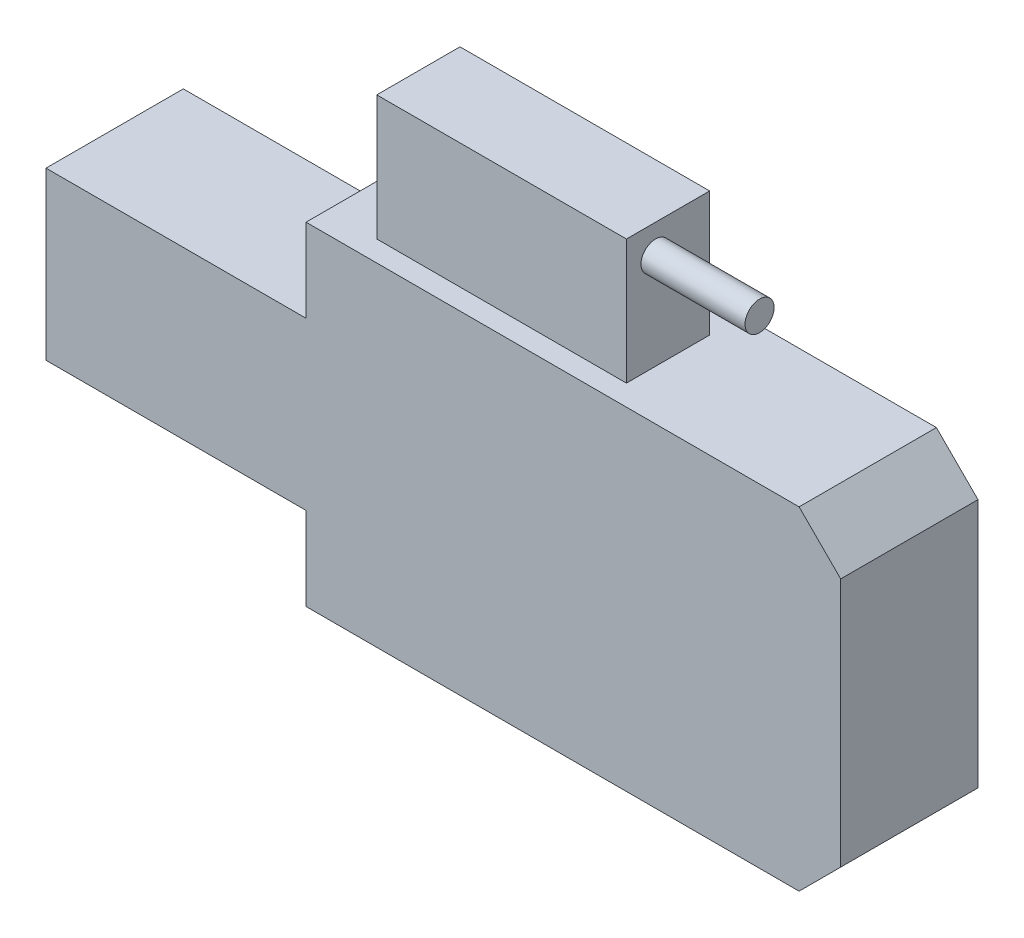
ISO-10303-21;
HEADER;
FILE_DESCRIPTION(('STEP AP214'),'2;1');
FILE_NAME('part.step','',(''),(''),'','','');
FILE_SCHEMA(('AUTOMOTIVE_DESIGN { 1 0 10303 214 1 1 1 1 }'));
ENDSEC;
DATA;
#1=APPLICATION_CONTEXT('core data for automotive mechanical design processes');
#2=APPLICATION_PROTOCOL_DEFINITION('international standard','automotive_design',2000,#1);
#3=PRODUCT_CONTEXT('',#1,'mechanical');
#4=PRODUCT('Part','Part','',(#3));
#5=PRODUCT_RELATED_PRODUCT_CATEGORY('part','',(#4));
#6=PRODUCT_DEFINITION_FORMATION('','',#4);
#7=PRODUCT_DEFINITION_CONTEXT('part definition',#1,'design');
#8=PRODUCT_DEFINITION('design','',#6,#7);
#9=PRODUCT_DEFINITION_SHAPE('','',#8);
#10=(LENGTH_UNIT() NAMED_UNIT(*) SI_UNIT(.MILLI.,.METRE.));
#11=(NAMED_UNIT(*) PLANE_ANGLE_UNIT() SI_UNIT($,.RADIAN.));
#12=(NAMED_UNIT(*) SI_UNIT($,.STERADIAN.) SOLID_ANGLE_UNIT());
#13=UNCERTAINTY_MEASURE_WITH_UNIT(LENGTH_MEASURE(1.E-05),#10,'distance_accuracy_value','');
#14=(GEOMETRIC_REPRESENTATION_CONTEXT(3) GLOBAL_UNCERTAINTY_ASSIGNED_CONTEXT((#13)) GLOBAL_UNIT_ASSIGNED_CONTEXT((#10,
#11,#12)) REPRESENTATION_CONTEXT('',''));
#15=CARTESIAN_POINT('',(0.,0.,0.));
#16=DIRECTION('',(0.,0.,1.));
#17=DIRECTION('',(1.,0.,0.));
#18=AXIS2_PLACEMENT_3D('',#15,#16,#17);
#19=CARTESIAN_POINT('',(159.5,103.,21.));
#20=DIRECTION('',(1.,0.,0.));
#21=DIRECTION('',(0.,0.,-1.));
#22=AXIS2_PLACEMENT_3D('',#19,#20,#21);
#23=PLANE('',#22);
#24=CARTESIAN_POINT('',(159.5,103.,21.));
#25=DIRECTION('',(-1.,0.,0.));
#26=DIRECTION('',(0.,0.,1.));
#27=AXIS2_PLACEMENT_3D('',#24,#25,#26);
#28=CIRCLE('',#27,3.5);
#29=CARTESIAN_POINT('',(159.5,103.,24.5));
#30=VERTEX_POINT('',#29);
#31=EDGE_CURVE('E19',#30,#30,#28,.T.);
#32=ORIENTED_EDGE('',*,*,#31,.F.);
#33=EDGE_LOOP('',(#32));
#34=FACE_BOUND('',#33,.T.);
#35=ADVANCED_FACE('F16',(#34),#23,.T.);
#36=CARTESIAN_POINT('',(134.5,110.,28.));
#37=DIRECTION('',(0.,-1.,0.));
#38=DIRECTION('',(0.,0.,-1.));
#39=AXIS2_PLACEMENT_3D('',#36,#37,#38);
#40=PLANE('',#39);
#41=DIRECTION('',(1.,0.,0.));
#42=VECTOR('',#41,1.);
#43=CARTESIAN_POINT('',(74.5,110.,8.));
#44=LINE('',#43,#42);
#45=CARTESIAN_POINT('',(134.5,110.,8.));
#46=VERTEX_POINT('',#45);
#47=CARTESIAN_POINT('',(74.5,110.,8.));
#48=VERTEX_POINT('',#47);
#49=EDGE_CURVE('E117',#46,#48,#44,.F.);
#50=ORIENTED_EDGE('',*,*,#49,.T.);
#51=DIRECTION('',(0.,0.,1.));
#52=VECTOR('',#51,1.);
#53=CARTESIAN_POINT('',(74.5,110.,28.));
#54=LINE('',#53,#52);
#55=CARTESIAN_POINT('',(74.5,110.,28.));
#56=VERTEX_POINT('',#55);
#57=EDGE_CURVE('E114',#48,#56,#54,.T.);
#58=ORIENTED_EDGE('',*,*,#57,.T.);
#59=DIRECTION('',(-1.,0.,0.));
#60=VECTOR('',#59,1.);
#61=CARTESIAN_POINT('',(134.5,110.,28.));
#62=LINE('',#61,#60);
#63=CARTESIAN_POINT('',(134.5,110.,28.));
#64=VERTEX_POINT('',#63);
#65=EDGE_CURVE('E155',#56,#64,#62,.F.);
#66=ORIENTED_EDGE('',*,*,#65,.T.);
#67=DIRECTION('',(0.,0.,1.));
#68=VECTOR('',#67,1.);
#69=CARTESIAN_POINT('',(134.5,110.,8.));
#70=LINE('',#69,#68);
#71=EDGE_CURVE('E120',#64,#46,#70,.F.);
#72=ORIENTED_EDGE('',*,*,#71,.T.);
#73=EDGE_LOOP('',(#50,#58,#66,#72));
#74=FACE_BOUND('',#73,.T.);
#75=ADVANCED_FACE('F118',(#74),#40,.F.);
#76=CARTESIAN_POINT('',(159.5,103.,21.));
#77=DIRECTION('',(-1.,0.,0.));
#78=DIRECTION('',(0.,0.,1.));
#79=AXIS2_PLACEMENT_3D('',#76,#77,#78);
#80=CYLINDRICAL_SURFACE('',#79,3.5);
#81=ORIENTED_EDGE('',*,*,#31,.T.);
#82=EDGE_LOOP('',(#81));
#83=FACE_BOUND('',#82,.T.);
#84=CARTESIAN_POINT('',(134.5,103.,21.));
#85=DIRECTION('',(-1.,0.,0.));
#86=DIRECTION('',(0.,0.,1.));
#87=AXIS2_PLACEMENT_3D('',#84,#85,#86);
#88=CIRCLE('',#87,3.5);
#89=CARTESIAN_POINT('',(134.5,103.,24.5));
#90=VERTEX_POINT('',#89);
#91=EDGE_CURVE('E139',#90,#90,#88,.F.);
#92=ORIENTED_EDGE('',*,*,#91,.T.);
#93=EDGE_LOOP('',(#92));
#94=FACE_BOUND('',#93,.T.);
#95=ADVANCED_FACE('F412',(#83,#94),#80,.T.);
#96=CARTESIAN_POINT('',(74.5,110.,8.));
#97=DIRECTION('',(0.,0.,1.));
#98=DIRECTION('',(1.,0.,0.));
#99=AXIS2_PLACEMENT_3D('',#96,#97,#98);
#100=PLANE('',#99);
#101=DIRECTION('',(0.,1.,0.));
#102=VECTOR('',#101,1.);
#103=CARTESIAN_POINT('',(74.5,110.,8.));
#104=LINE('',#103,#102);
#105=CARTESIAN_POINT('',(74.5,80.,8.));
#106=VERTEX_POINT('',#105);
#107=EDGE_CURVE('E125',#106,#48,#104,.T.);
#108=ORIENTED_EDGE('',*,*,#107,.T.);
#109=ORIENTED_EDGE('',*,*,#49,.F.);
#110=DIRECTION('',(0.,1.,0.));
#111=VECTOR('',#110,1.);
#112=CARTESIAN_POINT('',(134.5,110.,8.));
#113=LINE('',#112,#111);
#114=CARTESIAN_POINT('',(134.5,80.,8.));
#115=VERTEX_POINT('',#114);
#116=EDGE_CURVE('E142',#46,#115,#113,.F.);
#117=ORIENTED_EDGE('',*,*,#116,.T.);
#118=DIRECTION('',(1.,0.,0.));
#119=VECTOR('',#118,1.);
#120=CARTESIAN_POINT('',(191.,80.,8.));
#121=LINE('',#120,#119);
#122=EDGE_CURVE('E136',#115,#106,#121,.F.);
#123=ORIENTED_EDGE('',*,*,#122,.T.);
#124=EDGE_LOOP('',(#108,#109,#117,#123));
#125=FACE_BOUND('',#124,.T.);
#126=ADVANCED_FACE('F135',(#125),#100,.F.);
#127=CARTESIAN_POINT('',(74.5,110.,28.));
#128=DIRECTION('',(1.,0.,0.));
#129=DIRECTION('',(0.,1.,0.));
#130=AXIS2_PLACEMENT_3D('',#127,#128,#129);
#131=PLANE('',#130);
#132=DIRECTION('',(0.,1.,0.));
#133=VECTOR('',#132,1.);
#134=CARTESIAN_POINT('',(74.5,110.,28.));
#135=LINE('',#134,#133);
#136=CARTESIAN_POINT('',(74.5,80.,28.));
#137=VERTEX_POINT('',#136);
#138=EDGE_CURVE('E132',#137,#56,#135,.T.);
#139=ORIENTED_EDGE('',*,*,#138,.T.);
#140=ORIENTED_EDGE('',*,*,#57,.F.);
#141=ORIENTED_EDGE('',*,*,#107,.F.);
#142=DIRECTION('',(0.,0.,1.));
#143=VECTOR('',#142,1.);
#144=CARTESIAN_POINT('',(74.5,80.,33.));
#145=LINE('',#144,#143);
#146=EDGE_CURVE('E166',#106,#137,#145,.T.);
#147=ORIENTED_EDGE('',*,*,#146,.T.);
#148=EDGE_LOOP('',(#139,#140,#141,#147));
#149=FACE_BOUND('',#148,.T.);
#150=ADVANCED_FACE('F129',(#149),#131,.F.);
#151=CARTESIAN_POINT('',(134.5,110.,28.));
#152=DIRECTION('',(0.,0.,-1.));
#153=DIRECTION('',(-1.,0.,0.));
#154=AXIS2_PLACEMENT_3D('',#151,#152,#153);
#155=PLANE('',#154);
#156=DIRECTION('',(0.,1.,0.));
#157=VECTOR('',#156,1.);
#158=CARTESIAN_POINT('',(134.5,110.,28.));
#159=LINE('',#158,#157);
#160=CARTESIAN_POINT('',(134.5,80.,28.));
#161=VERTEX_POINT('',#160);
#162=EDGE_CURVE('E149',#161,#64,#159,.T.);
#163=ORIENTED_EDGE('',*,*,#162,.T.);
#164=ORIENTED_EDGE('',*,*,#65,.F.);
#165=ORIENTED_EDGE('',*,*,#138,.F.);
#166=DIRECTION('',(1.,0.,0.));
#167=VECTOR('',#166,1.);
#168=CARTESIAN_POINT('',(191.,80.,28.));
#169=LINE('',#168,#167);
#170=EDGE_CURVE('E163',#137,#161,#169,.T.);
#171=ORIENTED_EDGE('',*,*,#170,.T.);
#172=EDGE_LOOP('',(#163,#164,#165,#171));
#173=FACE_BOUND('',#172,.T.);
#174=ADVANCED_FACE('F161',(#173),#155,.F.);
#175=CARTESIAN_POINT('',(134.5,110.,8.));
#176=DIRECTION('',(-1.,0.,0.));
#177=DIRECTION('',(0.,0.,1.));
#178=AXIS2_PLACEMENT_3D('',#175,#176,#177);
#179=PLANE('',#178);
#180=ORIENTED_EDGE('',*,*,#91,.F.);
#181=EDGE_LOOP('',(#180));
#182=FACE_BOUND('',#181,.T.);
#183=ORIENTED_EDGE('',*,*,#116,.F.);
#184=ORIENTED_EDGE('',*,*,#71,.F.);
#185=ORIENTED_EDGE('',*,*,#162,.F.);
#186=DIRECTION('',(0.,0.,1.));
#187=VECTOR('',#186,1.);
#188=CARTESIAN_POINT('',(134.5,80.,33.));
#189=LINE('',#188,#187);
#190=EDGE_CURVE('E165',#161,#115,#189,.F.);
#191=ORIENTED_EDGE('',*,*,#190,.T.);
#192=EDGE_LOOP('',(#183,#184,#185,#191));
#193=FACE_BOUND('',#192,.T.);
#194=ADVANCED_FACE('F158',(#182,#193),#179,.F.);
#195=CARTESIAN_POINT('',(0.,0.,33.));
#196=DIRECTION('',(0.,0.,1.));
#197=DIRECTION('',(1.,0.,0.));
#198=AXIS2_PLACEMENT_3D('',#195,#196,#197);
#199=PLANE('',#198);
#200=DIRECTION('',(1.,0.,0.));
#201=VECTOR('',#200,1.);
#202=CARTESIAN_POINT('',(191.,80.,33.));
#203=LINE('',#202,#201);
#204=CARTESIAN_POINT('',(181.,80.,33.));
#205=VERTEX_POINT('',#204);
#206=CARTESIAN_POINT('',(62.5,80.,33.));
#207=VERTEX_POINT('',#206);
#208=EDGE_CURVE('E174',#205,#207,#203,.F.);
#209=ORIENTED_EDGE('',*,*,#208,.T.);
#210=DIRECTION('',(0.,1.,0.));
#211=VECTOR('',#210,1.);
#212=CARTESIAN_POINT('',(62.5,80.,33.));
#213=LINE('',#212,#211);
#214=CARTESIAN_POINT('',(62.5,60.,33.));
#215=VERTEX_POINT('',#214);
#216=EDGE_CURVE('E237',#207,#215,#213,.F.);
#217=ORIENTED_EDGE('',*,*,#216,.T.);
#218=DIRECTION('',(1.,0.,0.));
#219=VECTOR('',#218,1.);
#220=CARTESIAN_POINT('',(62.5,60.,33.));
#221=LINE('',#220,#219);
#222=CARTESIAN_POINT('',(0.,60.,33.));
#223=VERTEX_POINT('',#222);
#224=EDGE_CURVE('E232',#215,#223,#221,.F.);
#225=ORIENTED_EDGE('',*,*,#224,.T.);
#226=DIRECTION('',(0.,1.,0.));
#227=VECTOR('',#226,1.);
#228=CARTESIAN_POINT('',(0.,80.,33.));
#229=LINE('',#228,#227);
#230=CARTESIAN_POINT('',(0.,20.,33.));
#231=VERTEX_POINT('',#230);
#232=EDGE_CURVE('E223',#223,#231,#229,.F.);
#233=ORIENTED_EDGE('',*,*,#232,.T.);
#234=DIRECTION('',(1.,0.,0.));
#235=VECTOR('',#234,1.);
#236=CARTESIAN_POINT('',(62.5,20.,33.));
#237=LINE('',#236,#235);
#238=CARTESIAN_POINT('',(62.5,20.,33.));
#239=VERTEX_POINT('',#238);
#240=EDGE_CURVE('E141',#231,#239,#237,.T.);
#241=ORIENTED_EDGE('',*,*,#240,.T.);
#242=DIRECTION('',(0.,1.,0.));
#243=VECTOR('',#242,1.);
#244=CARTESIAN_POINT('',(62.5,0.,33.));
#245=LINE('',#244,#243);
#246=CARTESIAN_POINT('',(62.5,0.,33.));
#247=VERTEX_POINT('',#246);
#248=EDGE_CURVE('E199',#239,#247,#245,.F.);
#249=ORIENTED_EDGE('',*,*,#248,.T.);
#250=DIRECTION('',(1.,0.,0.));
#251=VECTOR('',#250,1.);
#252=CARTESIAN_POINT('',(0.,0.,33.));
#253=LINE('',#252,#251);
#254=CARTESIAN_POINT('',(181.,0.,33.));
#255=VERTEX_POINT('',#254);
#256=EDGE_CURVE('E194',#247,#255,#253,.T.);
#257=ORIENTED_EDGE('',*,*,#256,.T.);
#258=DIRECTION('',(-0.70710678118655,-0.707106781186546,0.));
#259=VECTOR('',#258,1.);
#260=CARTESIAN_POINT('',(191.,9.99999999999998,33.));
#261=LINE('',#260,#259);
#262=CARTESIAN_POINT('',(191.,9.99999999999998,33.));
#263=VERTEX_POINT('',#262);
#264=EDGE_CURVE('E189',#255,#263,#261,.F.);
#265=ORIENTED_EDGE('',*,*,#264,.T.);
#266=DIRECTION('',(0.,1.,0.));
#267=VECTOR('',#266,1.);
#268=CARTESIAN_POINT('',(191.,0.,33.));
#269=LINE('',#268,#267);
#270=CARTESIAN_POINT('',(191.,69.9999999999999,33.));
#271=VERTEX_POINT('',#270);
#272=EDGE_CURVE('E184',#263,#271,#269,.T.);
#273=ORIENTED_EDGE('',*,*,#272,.T.);
#274=DIRECTION('',(0.707106781186547,-0.707106781186549,0.));
#275=VECTOR('',#274,1.);
#276=CARTESIAN_POINT('',(181.,80.,33.));
#277=LINE('',#276,#275);
#278=EDGE_CURVE('E179',#271,#205,#277,.F.);
#279=ORIENTED_EDGE('',*,*,#278,.T.);
#280=EDGE_LOOP('',(#209,#217,#225,#233,#241,#249,#257,#265,#273,#279));
#281=FACE_BOUND('',#280,.T.);
#282=ADVANCED_FACE('F271',(#281),#199,.T.);
#283=CARTESIAN_POINT('',(62.5,20.,0.));
#284=DIRECTION('',(0.,1.,0.));
#285=DIRECTION('',(0.,0.,1.));
#286=AXIS2_PLACEMENT_3D('',#283,#284,#285);
#287=PLANE('',#286);
#288=DIRECTION('',(0.,0.,-1.));
#289=VECTOR('',#288,1.);
#290=CARTESIAN_POINT('',(0.,20.,33.));
#291=LINE('',#290,#289);
#292=CARTESIAN_POINT('',(0.,20.,0.));
#293=VERTEX_POINT('',#292);
#294=EDGE_CURVE('E230',#231,#293,#291,.T.);
#295=ORIENTED_EDGE('',*,*,#294,.T.);
#296=DIRECTION('',(1.,0.,0.));
#297=VECTOR('',#296,1.);
#298=CARTESIAN_POINT('',(0.,20.,0.));
#299=LINE('',#298,#297);
#300=CARTESIAN_POINT('',(62.5,20.,0.));
#301=VERTEX_POINT('',#300);
#302=EDGE_CURVE('E206',#293,#301,#299,.T.);
#303=ORIENTED_EDGE('',*,*,#302,.T.);
#304=DIRECTION('',(0.,0.,-1.));
#305=VECTOR('',#304,1.);
#306=CARTESIAN_POINT('',(62.5,20.,0.));
#307=LINE('',#306,#305);
#308=EDGE_CURVE('E145',#301,#239,#307,.F.);
#309=ORIENTED_EDGE('',*,*,#308,.T.);
#310=ORIENTED_EDGE('',*,*,#240,.F.);
#311=EDGE_LOOP('',(#295,#303,#309,#310));
#312=FACE_BOUND('',#311,.T.);
#313=ADVANCED_FACE('F204',(#312),#287,.F.);
#314=CARTESIAN_POINT('',(62.5,0.,0.));
#315=DIRECTION('',(1.,0.,0.));
#316=DIRECTION('',(0.,0.,-1.));
#317=AXIS2_PLACEMENT_3D('',#314,#315,#316);
#318=PLANE('',#317);
#319=ORIENTED_EDGE('',*,*,#308,.F.);
#320=DIRECTION('',(0.,1.,0.));
#321=VECTOR('',#320,1.);
#322=CARTESIAN_POINT('',(62.5,0.,0.));
#323=LINE('',#322,#321);
#324=CARTESIAN_POINT('',(62.5,0.,0.));
#325=VERTEX_POINT('',#324);
#326=EDGE_CURVE('E212',#301,#325,#323,.F.);
#327=ORIENTED_EDGE('',*,*,#326,.T.);
#328=DIRECTION('',(0.,0.,1.));
#329=VECTOR('',#328,1.);
#330=CARTESIAN_POINT('',(62.5,0.,33.));
#331=LINE('',#330,#329);
#332=EDGE_CURVE('E196',#325,#247,#331,.T.);
#333=ORIENTED_EDGE('',*,*,#332,.T.);
#334=ORIENTED_EDGE('',*,*,#248,.F.);
#335=EDGE_LOOP('',(#319,#327,#333,#334));
#336=FACE_BOUND('',#335,.T.);
#337=ADVANCED_FACE('F211',(#336),#318,.F.);
#338=CARTESIAN_POINT('',(0.,0.,33.));
#339=DIRECTION('',(0.,1.,0.));
#340=DIRECTION('',(0.,0.,1.));
#341=AXIS2_PLACEMENT_3D('',#338,#339,#340);
#342=PLANE('',#341);
#343=ORIENTED_EDGE('',*,*,#332,.F.);
#344=DIRECTION('',(1.,0.,0.));
#345=VECTOR('',#344,1.);
#346=CARTESIAN_POINT('',(0.,0.,0.));
#347=LINE('',#346,#345);
#348=CARTESIAN_POINT('',(181.,0.,0.));
#349=VERTEX_POINT('',#348);
#350=EDGE_CURVE('E219',#325,#349,#347,.T.);
#351=ORIENTED_EDGE('',*,*,#350,.T.);
#352=DIRECTION('',(0.,0.,1.));
#353=VECTOR('',#352,1.);
#354=CARTESIAN_POINT('',(181.,0.,33.));
#355=LINE('',#354,#353);
#356=EDGE_CURVE('E191',#349,#255,#355,.T.);
#357=ORIENTED_EDGE('',*,*,#356,.T.);
#358=ORIENTED_EDGE('',*,*,#256,.F.);
#359=EDGE_LOOP('',(#343,#351,#357,#358));
#360=FACE_BOUND('',#359,.T.);
#361=ADVANCED_FACE('F268',(#360),#342,.F.);
#362=CARTESIAN_POINT('',(191.,9.99999999999998,33.));
#363=DIRECTION('',(-0.707106781186546,0.70710678118655,0.));
#364=DIRECTION('',(-0.70710678118655,-0.707106781186546,0.));
#365=AXIS2_PLACEMENT_3D('',#362,#363,#364);
#366=PLANE('',#365);
#367=ORIENTED_EDGE('',*,*,#356,.F.);
#368=DIRECTION('',(0.707106781186549,0.707106781186545,0.));
#369=VECTOR('',#368,1.);
#370=CARTESIAN_POINT('',(181.,0.,0.));
#371=LINE('',#370,#369);
#372=CARTESIAN_POINT('',(191.,9.99999999999998,0.));
#373=VERTEX_POINT('',#372);
#374=EDGE_CURVE('E221',#349,#373,#371,.T.);
#375=ORIENTED_EDGE('',*,*,#374,.T.);
#376=DIRECTION('',(0.,0.,1.));
#377=VECTOR('',#376,1.);
#378=CARTESIAN_POINT('',(191.,9.99999999999998,33.));
#379=LINE('',#378,#377);
#380=EDGE_CURVE('E186',#373,#263,#379,.T.);
#381=ORIENTED_EDGE('',*,*,#380,.T.);
#382=ORIENTED_EDGE('',*,*,#264,.F.);
#383=EDGE_LOOP('',(#367,#375,#381,#382));
#384=FACE_BOUND('',#383,.T.);
#385=ADVANCED_FACE('F264',(#384),#366,.F.);
#386=CARTESIAN_POINT('',(191.,0.,33.));
#387=DIRECTION('',(-1.,0.,0.));
#388=DIRECTION('',(0.,0.,1.));
#389=AXIS2_PLACEMENT_3D('',#386,#387,#388);
#390=PLANE('',#389);
#391=DIRECTION('',(0.,0.,1.));
#392=VECTOR('',#391,1.);
#393=CARTESIAN_POINT('',(191.,69.9999999999999,33.));
#394=LINE('',#393,#392);
#395=CARTESIAN_POINT('',(191.,69.9999999999999,0.));
#396=VERTEX_POINT('',#395);
#397=EDGE_CURVE('E181',#396,#271,#394,.T.);
#398=ORIENTED_EDGE('',*,*,#397,.T.);
#399=ORIENTED_EDGE('',*,*,#272,.F.);
#400=ORIENTED_EDGE('',*,*,#380,.F.);
#401=DIRECTION('',(0.,1.,0.));
#402=VECTOR('',#401,1.);
#403=CARTESIAN_POINT('',(191.,0.,0.));
#404=LINE('',#403,#402);
#405=EDGE_CURVE('E260',#373,#396,#404,.T.);
#406=ORIENTED_EDGE('',*,*,#405,.T.);
#407=EDGE_LOOP('',(#398,#399,#400,#406));
#408=FACE_BOUND('',#407,.T.);
#409=ADVANCED_FACE('F327',(#408),#390,.F.);
#410=CARTESIAN_POINT('',(181.,80.,33.));
#411=DIRECTION('',(-0.707106781186549,-0.707106781186547,0.));
#412=DIRECTION('',(0.707106781186547,-0.707106781186549,0.));
#413=AXIS2_PLACEMENT_3D('',#410,#411,#412);
#414=PLANE('',#413);
#415=ORIENTED_EDGE('',*,*,#397,.F.);
#416=DIRECTION('',(-0.707106781186547,0.707106781186548,0.));
#417=VECTOR('',#416,1.);
#418=CARTESIAN_POINT('',(191.,70.,0.));
#419=LINE('',#418,#417);
#420=CARTESIAN_POINT('',(181.,80.,0.));
#421=VERTEX_POINT('',#420);
#422=EDGE_CURVE('E256',#396,#421,#419,.T.);
#423=ORIENTED_EDGE('',*,*,#422,.T.);
#424=DIRECTION('',(0.,0.,1.));
#425=VECTOR('',#424,1.);
#426=CARTESIAN_POINT('',(181.,80.,33.));
#427=LINE('',#426,#425);
#428=EDGE_CURVE('E176',#421,#205,#427,.T.);
#429=ORIENTED_EDGE('',*,*,#428,.T.);
#430=ORIENTED_EDGE('',*,*,#278,.F.);
#431=EDGE_LOOP('',(#415,#423,#429,#430));
#432=FACE_BOUND('',#431,.T.);
#433=ADVANCED_FACE('F318',(#432),#414,.F.);
#434=CARTESIAN_POINT('',(191.,80.,33.));
#435=DIRECTION('',(0.,-1.,0.));
#436=DIRECTION('',(1.,0.,0.));
#437=AXIS2_PLACEMENT_3D('',#434,#435,#436);
#438=PLANE('',#437);
#439=ORIENTED_EDGE('',*,*,#170,.F.);
#440=ORIENTED_EDGE('',*,*,#146,.F.);
#441=ORIENTED_EDGE('',*,*,#122,.F.);
#442=ORIENTED_EDGE('',*,*,#190,.F.);
#443=EDGE_LOOP('',(#439,#440,#441,#442));
#444=FACE_BOUND('',#443,.T.);
#445=DIRECTION('',(0.,0.,-1.));
#446=VECTOR('',#445,1.);
#447=CARTESIAN_POINT('',(62.5,80.,0.));
#448=LINE('',#447,#446);
#449=CARTESIAN_POINT('',(62.5,80.,0.));
#450=VERTEX_POINT('',#449);
#451=EDGE_CURVE('E168',#450,#207,#448,.F.);
#452=ORIENTED_EDGE('',*,*,#451,.T.);
#453=ORIENTED_EDGE('',*,*,#208,.F.);
#454=ORIENTED_EDGE('',*,*,#428,.F.);
#455=DIRECTION('',(1.,0.,0.));
#456=VECTOR('',#455,1.);
#457=CARTESIAN_POINT('',(0.,80.,0.));
#458=LINE('',#457,#456);
#459=EDGE_CURVE('E244',#421,#450,#458,.F.);
#460=ORIENTED_EDGE('',*,*,#459,.T.);
#461=EDGE_LOOP('',(#452,#453,#454,#460));
#462=FACE_BOUND('',#461,.T.);
#463=ADVANCED_FACE('F242',(#444,#462),#438,.F.);
#464=CARTESIAN_POINT('',(62.5,80.,0.));
#465=DIRECTION('',(1.,0.,0.));
#466=DIRECTION('',(0.,0.,-1.));
#467=AXIS2_PLACEMENT_3D('',#464,#465,#466);
#468=PLANE('',#467);
#469=ORIENTED_EDGE('',*,*,#451,.F.);
#470=DIRECTION('',(0.,1.,0.));
#471=VECTOR('',#470,1.);
#472=CARTESIAN_POINT('',(62.5,0.,0.));
#473=LINE('',#472,#471);
#474=CARTESIAN_POINT('',(62.5,60.,0.));
#475=VERTEX_POINT('',#474);
#476=EDGE_CURVE('E250',#450,#475,#473,.F.);
#477=ORIENTED_EDGE('',*,*,#476,.T.);
#478=DIRECTION('',(0.,0.,-1.));
#479=VECTOR('',#478,1.);
#480=CARTESIAN_POINT('',(62.5,60.,0.));
#481=LINE('',#480,#479);
#482=EDGE_CURVE('E234',#475,#215,#481,.F.);
#483=ORIENTED_EDGE('',*,*,#482,.T.);
#484=ORIENTED_EDGE('',*,*,#216,.F.);
#485=EDGE_LOOP('',(#469,#477,#483,#484));
#486=FACE_BOUND('',#485,.T.);
#487=ADVANCED_FACE('F249',(#486),#468,.F.);
#488=CARTESIAN_POINT('',(62.5,60.,0.));
#489=DIRECTION('',(0.,-1.,0.));
#490=DIRECTION('',(0.,0.,-1.));
#491=AXIS2_PLACEMENT_3D('',#488,#489,#490);
#492=PLANE('',#491);
#493=ORIENTED_EDGE('',*,*,#482,.F.);
#494=DIRECTION('',(1.,0.,0.));
#495=VECTOR('',#494,1.);
#496=CARTESIAN_POINT('',(0.,60.,0.));
#497=LINE('',#496,#495);
#498=CARTESIAN_POINT('',(0.,60.,0.));
#499=VERTEX_POINT('',#498);
#500=EDGE_CURVE('E25',#475,#499,#497,.F.);
#501=ORIENTED_EDGE('',*,*,#500,.T.);
#502=DIRECTION('',(0.,0.,-1.));
#503=VECTOR('',#502,1.);
#504=CARTESIAN_POINT('',(0.,60.,33.));
#505=LINE('',#504,#503);
#506=EDGE_CURVE('E33',#499,#223,#505,.F.);
#507=ORIENTED_EDGE('',*,*,#506,.T.);
#508=ORIENTED_EDGE('',*,*,#224,.F.);
#509=EDGE_LOOP('',(#493,#501,#507,#508));
#510=FACE_BOUND('',#509,.T.);
#511=ADVANCED_FACE('F276',(#510),#492,.F.);
#512=CARTESIAN_POINT('',(0.,80.,33.));
#513=DIRECTION('',(1.,0.,0.));
#514=DIRECTION('',(0.,0.,-1.));
#515=AXIS2_PLACEMENT_3D('',#512,#513,#514);
#516=PLANE('',#515);
#517=ORIENTED_EDGE('',*,*,#506,.F.);
#518=DIRECTION('',(0.,1.,0.));
#519=VECTOR('',#518,1.);
#520=CARTESIAN_POINT('',(0.,0.,0.));
#521=LINE('',#520,#519);
#522=EDGE_CURVE('E11',#499,#293,#521,.F.);
#523=ORIENTED_EDGE('',*,*,#522,.T.);
#524=ORIENTED_EDGE('',*,*,#294,.F.);
#525=ORIENTED_EDGE('',*,*,#232,.F.);
#526=EDGE_LOOP('',(#517,#523,#524,#525));
#527=FACE_BOUND('',#526,.T.);
#528=ADVANCED_FACE('F274',(#527),#516,.F.);
#529=CARTESIAN_POINT('',(0.,0.,0.));
#530=DIRECTION('',(0.,0.,1.));
#531=DIRECTION('',(1.,0.,0.));
#532=AXIS2_PLACEMENT_3D('',#529,#530,#531);
#533=PLANE('',#532);
#534=ORIENTED_EDGE('',*,*,#500,.F.);
#535=ORIENTED_EDGE('',*,*,#476,.F.);
#536=ORIENTED_EDGE('',*,*,#459,.F.);
#537=ORIENTED_EDGE('',*,*,#422,.F.);
#538=ORIENTED_EDGE('',*,*,#405,.F.);
#539=ORIENTED_EDGE('',*,*,#374,.F.);
#540=ORIENTED_EDGE('',*,*,#350,.F.);
#541=ORIENTED_EDGE('',*,*,#326,.F.);
#542=ORIENTED_EDGE('',*,*,#302,.F.);
#543=ORIENTED_EDGE('',*,*,#522,.F.);
#544=EDGE_LOOP('',(#534,#535,#536,#537,#538,#539,#540,#541,#542,#543));
#545=FACE_BOUND('',#544,.T.);
#546=ADVANCED_FACE('F216',(#545),#533,.F.);
#547=CLOSED_SHELL('',(#35,#75,#95,#126,#150,#174,#194,#282,#313,#337,#361,#385,#409,#433,#463,
#487,#511,#528,#546));
#548=MANIFOLD_SOLID_BREP('B1',#547);
#549=ADVANCED_BREP_SHAPE_REPRESENTATION('',(#18,#548),#14);
#550=SHAPE_DEFINITION_REPRESENTATION(#9,#549);
ENDSEC;
END-ISO-10303-21;
